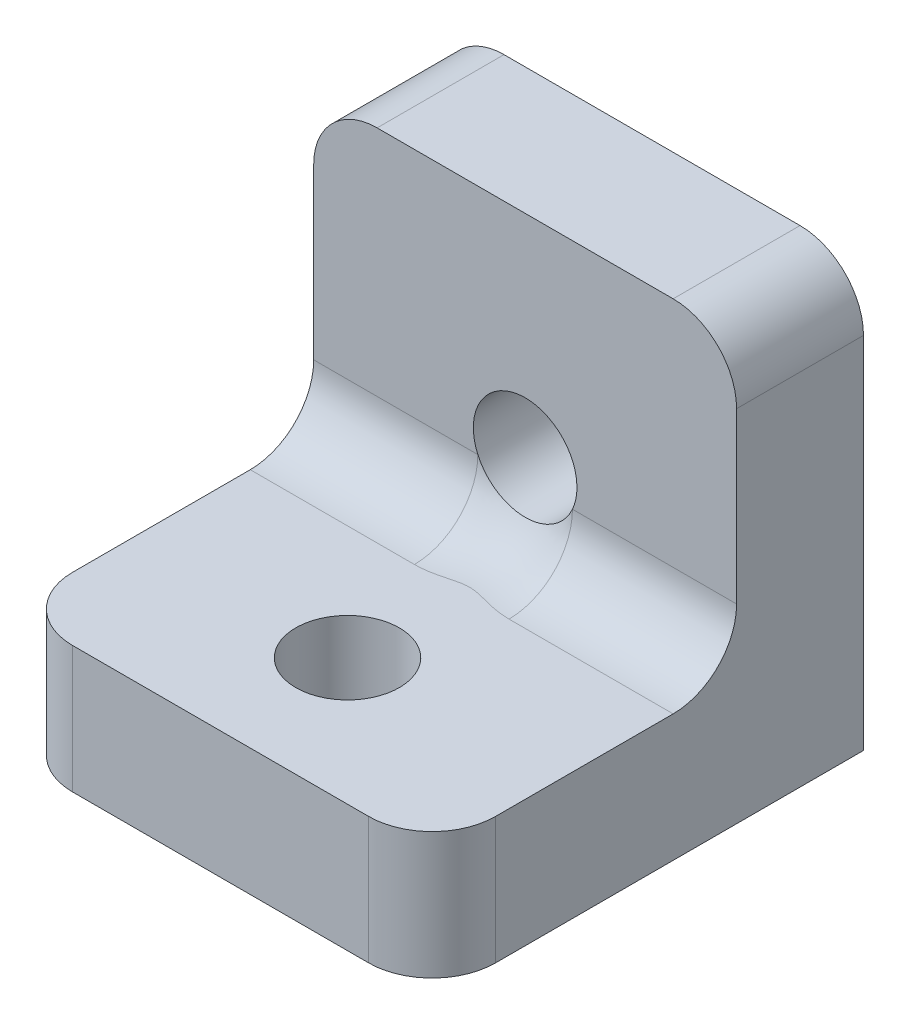
ISO-10303-21;
HEADER;
FILE_DESCRIPTION(('STEP AP214'),'2;1');
FILE_NAME('part.step','',(''),(''),'','','');
FILE_SCHEMA(('AUTOMOTIVE_DESIGN { 1 0 10303 214 1 1 1 1 }'));
ENDSEC;
DATA;
#1=APPLICATION_CONTEXT('core data for automotive mechanical design processes');
#2=APPLICATION_PROTOCOL_DEFINITION('international standard','automotive_design',2000,#1);
#3=PRODUCT_CONTEXT('',#1,'mechanical');
#4=PRODUCT('Part','Part','',(#3));
#5=PRODUCT_RELATED_PRODUCT_CATEGORY('part','',(#4));
#6=PRODUCT_DEFINITION_FORMATION('','',#4);
#7=PRODUCT_DEFINITION_CONTEXT('part definition',#1,'design');
#8=PRODUCT_DEFINITION('design','',#6,#7);
#9=PRODUCT_DEFINITION_SHAPE('','',#8);
#10=(LENGTH_UNIT() NAMED_UNIT(*) SI_UNIT(.MILLI.,.METRE.));
#11=(NAMED_UNIT(*) PLANE_ANGLE_UNIT() SI_UNIT($,.RADIAN.));
#12=(NAMED_UNIT(*) SI_UNIT($,.STERADIAN.) SOLID_ANGLE_UNIT());
#13=UNCERTAINTY_MEASURE_WITH_UNIT(LENGTH_MEASURE(1.E-05),#10,'distance_accuracy_value','');
#14=(GEOMETRIC_REPRESENTATION_CONTEXT(3) GLOBAL_UNCERTAINTY_ASSIGNED_CONTEXT((#13)) GLOBAL_UNIT_ASSIGNED_CONTEXT((#10,
#11,#12)) REPRESENTATION_CONTEXT('',''));
#15=CARTESIAN_POINT('',(0.,0.,0.));
#16=DIRECTION('',(0.,0.,1.));
#17=DIRECTION('',(1.,0.,0.));
#18=AXIS2_PLACEMENT_3D('',#15,#16,#17);
#19=CARTESIAN_POINT('',(0.,0.,6.));
#20=DIRECTION('',(1.,0.,0.));
#21=DIRECTION('',(0.,1.,0.));
#22=AXIS2_PLACEMENT_3D('',#19,#20,#21);
#23=PLANE('',#22);
#24=DIRECTION('',(0.,-1.,0.));
#25=VECTOR('',#24,1.);
#26=CARTESIAN_POINT('',(0.,0.,6.));
#27=LINE('',#26,#25);
#28=CARTESIAN_POINT('',(0.,-3.,6.));
#29=VERTEX_POINT('',#28);
#30=CARTESIAN_POINT('',(0.,-11.,6.));
#31=VERTEX_POINT('',#30);
#32=EDGE_CURVE('E167',#29,#31,#27,.T.);
#33=ORIENTED_EDGE('',*,*,#32,.F.);
#34=DIRECTION('',(0.,0.,-1.));
#35=VECTOR('',#34,1.);
#36=CARTESIAN_POINT('',(0.,-3.,6.));
#37=LINE('',#36,#35);
#38=CARTESIAN_POINT('',(0.,-3.,0.));
#39=VERTEX_POINT('',#38);
#40=EDGE_CURVE('E153',#29,#39,#37,.T.);
#41=ORIENTED_EDGE('',*,*,#40,.T.);
#42=DIRECTION('',(0.,-1.,0.));
#43=VECTOR('',#42,1.);
#44=CARTESIAN_POINT('',(0.,0.,0.));
#45=LINE('',#44,#43);
#46=CARTESIAN_POINT('',(0.,-20.,0.));
#47=VERTEX_POINT('',#46);
#48=EDGE_CURVE('E151',#39,#47,#45,.T.);
#49=ORIENTED_EDGE('',*,*,#48,.T.);
#50=DIRECTION('',(0.,0.,-1.));
#51=VECTOR('',#50,1.);
#52=CARTESIAN_POINT('',(0.,-20.,6.));
#53=LINE('',#52,#51);
#54=CARTESIAN_POINT('',(0.,-20.,17.4));
#55=VERTEX_POINT('',#54);
#56=EDGE_CURVE('E136',#55,#47,#53,.T.);
#57=ORIENTED_EDGE('',*,*,#56,.F.);
#58=DIRECTION('',(0.,-1.,0.));
#59=VECTOR('',#58,1.);
#60=CARTESIAN_POINT('',(0.,0.,17.4));
#61=LINE('',#60,#59);
#62=CARTESIAN_POINT('',(0.,-14.,17.4));
#63=VERTEX_POINT('',#62);
#64=EDGE_CURVE('E146',#55,#63,#61,.F.);
#65=ORIENTED_EDGE('',*,*,#64,.T.);
#66=DIRECTION('',(0.,0.,-1.));
#67=VECTOR('',#66,1.);
#68=CARTESIAN_POINT('',(0.,-14.,20.4));
#69=LINE('',#68,#67);
#70=CARTESIAN_POINT('',(0.,-14.,9.));
#71=VERTEX_POINT('',#70);
#72=EDGE_CURVE('E266',#63,#71,#69,.T.);
#73=ORIENTED_EDGE('',*,*,#72,.T.);
#74=CARTESIAN_POINT('',(0.,-11.,9.));
#75=DIRECTION('',(1.,0.,0.));
#76=DIRECTION('',(0.,1.,0.));
#77=AXIS2_PLACEMENT_3D('',#74,#75,#76);
#78=CIRCLE('',#77,3.);
#79=EDGE_CURVE('E48',#71,#31,#78,.T.);
#80=ORIENTED_EDGE('',*,*,#79,.T.);
#81=EDGE_LOOP('',(#33,#41,#49,#57,#65,#73,#80));
#82=FACE_BOUND('',#81,.T.);
#83=ADVANCED_FACE('F35',(#82),#23,.F.);
#84=CARTESIAN_POINT('',(0.,-20.,6.));
#85=DIRECTION('',(0.,1.,0.));
#86=DIRECTION('',(0.,0.,1.));
#87=AXIS2_PLACEMENT_3D('',#84,#85,#86);
#88=PLANE('',#87);
#89=CARTESIAN_POINT('',(10.,-20.,14.4));
#90=DIRECTION('',(0.,1.,0.));
#91=DIRECTION('',(0.,0.,1.));
#92=AXIS2_PLACEMENT_3D('',#89,#90,#91);
#93=CIRCLE('',#92,2.45);
#94=CARTESIAN_POINT('',(10.,-20.,16.85));
#95=VERTEX_POINT('',#94);
#96=EDGE_CURVE('E313',#95,#95,#93,.T.);
#97=ORIENTED_EDGE('',*,*,#96,.T.);
#98=EDGE_LOOP('',(#97));
#99=FACE_BOUND('',#98,.T.);
#100=DIRECTION('',(0.,0.,-1.));
#101=VECTOR('',#100,1.);
#102=CARTESIAN_POINT('',(20.,-20.,6.));
#103=LINE('',#102,#101);
#104=CARTESIAN_POINT('',(20.,-20.,17.4));
#105=VERTEX_POINT('',#104);
#106=CARTESIAN_POINT('',(20.,-20.,0.));
#107=VERTEX_POINT('',#106);
#108=EDGE_CURVE('E147',#105,#107,#103,.T.);
#109=ORIENTED_EDGE('',*,*,#108,.F.);
#110=CARTESIAN_POINT('',(17.,-20.,17.4));
#111=DIRECTION('',(0.,1.,0.));
#112=DIRECTION('',(0.,0.,1.));
#113=AXIS2_PLACEMENT_3D('',#110,#111,#112);
#114=CIRCLE('',#113,3.);
#115=CARTESIAN_POINT('',(17.,-20.,20.4));
#116=VERTEX_POINT('',#115);
#117=EDGE_CURVE('E201',#105,#116,#114,.F.);
#118=ORIENTED_EDGE('',*,*,#117,.T.);
#119=DIRECTION('',(1.,0.,0.));
#120=VECTOR('',#119,1.);
#121=CARTESIAN_POINT('',(0.,-20.,20.4));
#122=LINE('',#121,#120);
#123=CARTESIAN_POINT('',(3.,-20.,20.4));
#124=VERTEX_POINT('',#123);
#125=EDGE_CURVE('E272',#124,#116,#122,.T.);
#126=ORIENTED_EDGE('',*,*,#125,.F.);
#127=CARTESIAN_POINT('',(3.,-20.,17.4));
#128=DIRECTION('',(0.,1.,0.));
#129=DIRECTION('',(0.,0.,1.));
#130=AXIS2_PLACEMENT_3D('',#127,#128,#129);
#131=CIRCLE('',#130,3.);
#132=EDGE_CURVE('E144',#124,#55,#131,.F.);
#133=ORIENTED_EDGE('',*,*,#132,.T.);
#134=ORIENTED_EDGE('',*,*,#56,.T.);
#135=DIRECTION('',(1.,0.,0.));
#136=VECTOR('',#135,1.);
#137=CARTESIAN_POINT('',(0.,-20.,0.));
#138=LINE('',#137,#136);
#139=EDGE_CURVE('E141',#47,#107,#138,.T.);
#140=ORIENTED_EDGE('',*,*,#139,.T.);
#141=EDGE_LOOP('',(#109,#118,#126,#133,#134,#140));
#142=FACE_BOUND('',#141,.T.);
#143=ADVANCED_FACE('F139',(#99,#142),#88,.F.);
#144=CARTESIAN_POINT('',(20.,0.,6.));
#145=DIRECTION('',(-1.,0.,0.));
#146=DIRECTION('',(0.,-1.,0.));
#147=AXIS2_PLACEMENT_3D('',#144,#145,#146);
#148=PLANE('',#147);
#149=DIRECTION('',(0.,1.,0.));
#150=VECTOR('',#149,1.);
#151=CARTESIAN_POINT('',(20.,0.,0.));
#152=LINE('',#151,#150);
#153=CARTESIAN_POINT('',(20.,-3.,0.));
#154=VERTEX_POINT('',#153);
#155=EDGE_CURVE('E159',#107,#154,#152,.T.);
#156=ORIENTED_EDGE('',*,*,#155,.T.);
#157=DIRECTION('',(0.,0.,-1.));
#158=VECTOR('',#157,1.);
#159=CARTESIAN_POINT('',(20.,-3.,6.));
#160=LINE('',#159,#158);
#161=CARTESIAN_POINT('',(20.,-3.,6.));
#162=VERTEX_POINT('',#161);
#163=EDGE_CURVE('E187',#154,#162,#160,.F.);
#164=ORIENTED_EDGE('',*,*,#163,.T.);
#165=DIRECTION('',(0.,1.,0.));
#166=VECTOR('',#165,1.);
#167=CARTESIAN_POINT('',(20.,0.,6.));
#168=LINE('',#167,#166);
#169=CARTESIAN_POINT('',(20.,-11.,6.));
#170=VERTEX_POINT('',#169);
#171=EDGE_CURVE('E277',#170,#162,#168,.T.);
#172=ORIENTED_EDGE('',*,*,#171,.F.);
#173=CARTESIAN_POINT('',(20.,-11.,9.));
#174=DIRECTION('',(-1.,0.,0.));
#175=DIRECTION('',(0.,-1.,0.));
#176=AXIS2_PLACEMENT_3D('',#173,#174,#175);
#177=CIRCLE('',#176,3.);
#178=CARTESIAN_POINT('',(20.,-14.,9.));
#179=VERTEX_POINT('',#178);
#180=EDGE_CURVE('E11',#170,#179,#177,.T.);
#181=ORIENTED_EDGE('',*,*,#180,.T.);
#182=DIRECTION('',(0.,0.,-1.));
#183=VECTOR('',#182,1.);
#184=CARTESIAN_POINT('',(20.,-14.,20.4));
#185=LINE('',#184,#183);
#186=CARTESIAN_POINT('',(20.,-14.,17.4));
#187=VERTEX_POINT('',#186);
#188=EDGE_CURVE('E155',#187,#179,#185,.T.);
#189=ORIENTED_EDGE('',*,*,#188,.F.);
#190=DIRECTION('',(0.,1.,0.));
#191=VECTOR('',#190,1.);
#192=CARTESIAN_POINT('',(20.,0.,17.4));
#193=LINE('',#192,#191);
#194=EDGE_CURVE('E185',#187,#105,#193,.F.);
#195=ORIENTED_EDGE('',*,*,#194,.T.);
#196=ORIENTED_EDGE('',*,*,#108,.T.);
#197=EDGE_LOOP('',(#156,#164,#172,#181,#189,#195,#196));
#198=FACE_BOUND('',#197,.T.);
#199=ADVANCED_FACE('F293',(#198),#148,.F.);
#200=CARTESIAN_POINT('',(0.,0.,6.));
#201=DIRECTION('',(0.,-1.,0.));
#202=DIRECTION('',(0.,0.,-1.));
#203=AXIS2_PLACEMENT_3D('',#200,#201,#202);
#204=PLANE('',#203);
#205=DIRECTION('',(-1.,0.,0.));
#206=VECTOR('',#205,1.);
#207=CARTESIAN_POINT('',(0.,0.,0.));
#208=LINE('',#207,#206);
#209=CARTESIAN_POINT('',(17.,0.,0.));
#210=VERTEX_POINT('',#209);
#211=CARTESIAN_POINT('',(3.,0.,0.));
#212=VERTEX_POINT('',#211);
#213=EDGE_CURVE('E161',#210,#212,#208,.T.);
#214=ORIENTED_EDGE('',*,*,#213,.T.);
#215=DIRECTION('',(0.,0.,-1.));
#216=VECTOR('',#215,1.);
#217=CARTESIAN_POINT('',(3.,0.,6.));
#218=LINE('',#217,#216);
#219=CARTESIAN_POINT('',(3.,0.,6.));
#220=VERTEX_POINT('',#219);
#221=EDGE_CURVE('E179',#212,#220,#218,.F.);
#222=ORIENTED_EDGE('',*,*,#221,.T.);
#223=DIRECTION('',(-1.,0.,0.));
#224=VECTOR('',#223,1.);
#225=CARTESIAN_POINT('',(0.,0.,6.));
#226=LINE('',#225,#224);
#227=CARTESIAN_POINT('',(17.,0.,6.));
#228=VERTEX_POINT('',#227);
#229=EDGE_CURVE('E168',#228,#220,#226,.T.);
#230=ORIENTED_EDGE('',*,*,#229,.F.);
#231=DIRECTION('',(0.,0.,-1.));
#232=VECTOR('',#231,1.);
#233=CARTESIAN_POINT('',(17.,0.,6.));
#234=LINE('',#233,#232);
#235=EDGE_CURVE('E176',#228,#210,#234,.T.);
#236=ORIENTED_EDGE('',*,*,#235,.T.);
#237=EDGE_LOOP('',(#214,#222,#230,#236));
#238=FACE_BOUND('',#237,.T.);
#239=ADVANCED_FACE('F288',(#238),#204,.F.);
#240=CARTESIAN_POINT('',(0.,0.,6.));
#241=DIRECTION('',(0.,0.,1.));
#242=DIRECTION('',(1.,0.,0.));
#243=AXIS2_PLACEMENT_3D('',#240,#241,#242);
#244=PLANE('',#243);
#245=ORIENTED_EDGE('',*,*,#32,.T.);
#246=DIRECTION('',(-1.,0.,0.));
#247=VECTOR('',#246,1.);
#248=CARTESIAN_POINT('',(0.,-11.,6.));
#249=LINE('',#248,#247);
#250=CARTESIAN_POINT('',(7.76337307536549,-11.,6.));
#251=VERTEX_POINT('',#250);
#252=EDGE_CURVE('E248',#31,#251,#249,.F.);
#253=ORIENTED_EDGE('',*,*,#252,.T.);
#254=CARTESIAN_POINT('',(10.,-10.,6.));
#255=DIRECTION('',(0.,0.,1.));
#256=DIRECTION('',(1.,0.,0.));
#257=AXIS2_PLACEMENT_3D('',#254,#255,#256);
#258=CIRCLE('',#257,2.45);
#259=CARTESIAN_POINT('',(12.2366269246345,-11.,6.));
#260=VERTEX_POINT('',#259);
#261=EDGE_CURVE('E309',#260,#251,#258,.T.);
#262=ORIENTED_EDGE('',*,*,#261,.F.);
#263=DIRECTION('',(-1.,0.,0.));
#264=VECTOR('',#263,1.);
#265=CARTESIAN_POINT('',(0.,-11.,6.));
#266=LINE('',#265,#264);
#267=EDGE_CURVE('E56',#260,#170,#266,.F.);
#268=ORIENTED_EDGE('',*,*,#267,.T.);
#269=ORIENTED_EDGE('',*,*,#171,.T.);
#270=CARTESIAN_POINT('',(17.,-3.,6.));
#271=DIRECTION('',(0.,0.,1.));
#272=DIRECTION('',(1.,0.,0.));
#273=AXIS2_PLACEMENT_3D('',#270,#271,#272);
#274=CIRCLE('',#273,3.);
#275=EDGE_CURVE('E181',#162,#228,#274,.T.);
#276=ORIENTED_EDGE('',*,*,#275,.T.);
#277=ORIENTED_EDGE('',*,*,#229,.T.);
#278=CARTESIAN_POINT('',(3.,-3.,6.));
#279=DIRECTION('',(0.,0.,1.));
#280=DIRECTION('',(1.,0.,0.));
#281=AXIS2_PLACEMENT_3D('',#278,#279,#280);
#282=CIRCLE('',#281,3.);
#283=EDGE_CURVE('E183',#220,#29,#282,.T.);
#284=ORIENTED_EDGE('',*,*,#283,.T.);
#285=EDGE_LOOP('',(#245,#253,#262,#268,#269,#276,#277,#284));
#286=FACE_BOUND('',#285,.T.);
#287=ADVANCED_FACE('F233',(#286),#244,.T.);
#288=CARTESIAN_POINT('',(0.,0.,0.));
#289=DIRECTION('',(0.,0.,1.));
#290=DIRECTION('',(1.,0.,0.));
#291=AXIS2_PLACEMENT_3D('',#288,#289,#290);
#292=PLANE('',#291);
#293=CARTESIAN_POINT('',(10.,-10.,0.));
#294=DIRECTION('',(0.,0.,1.));
#295=DIRECTION('',(1.,0.,0.));
#296=AXIS2_PLACEMENT_3D('',#293,#294,#295);
#297=CIRCLE('',#296,2.45);
#298=CARTESIAN_POINT('',(12.45,-10.,0.));
#299=VERTEX_POINT('',#298);
#300=EDGE_CURVE('E305',#299,#299,#297,.T.);
#301=ORIENTED_EDGE('',*,*,#300,.T.);
#302=EDGE_LOOP('',(#301));
#303=FACE_BOUND('',#302,.T.);
#304=ORIENTED_EDGE('',*,*,#48,.F.);
#305=CARTESIAN_POINT('',(3.,-3.,0.));
#306=DIRECTION('',(0.,0.,1.));
#307=DIRECTION('',(1.,0.,0.));
#308=AXIS2_PLACEMENT_3D('',#305,#306,#307);
#309=CIRCLE('',#308,3.);
#310=EDGE_CURVE('E174',#39,#212,#309,.F.);
#311=ORIENTED_EDGE('',*,*,#310,.T.);
#312=ORIENTED_EDGE('',*,*,#213,.F.);
#313=CARTESIAN_POINT('',(17.,-3.,0.));
#314=DIRECTION('',(0.,0.,1.));
#315=DIRECTION('',(1.,0.,0.));
#316=AXIS2_PLACEMENT_3D('',#313,#314,#315);
#317=CIRCLE('',#316,3.);
#318=EDGE_CURVE('E172',#210,#154,#317,.F.);
#319=ORIENTED_EDGE('',*,*,#318,.T.);
#320=ORIENTED_EDGE('',*,*,#155,.F.);
#321=ORIENTED_EDGE('',*,*,#139,.F.);
#322=EDGE_LOOP('',(#304,#311,#312,#319,#320,#321));
#323=FACE_BOUND('',#322,.T.);
#324=ADVANCED_FACE('F157',(#303,#323),#292,.F.);
#325=CARTESIAN_POINT('',(0.,-14.,20.4));
#326=DIRECTION('',(0.,-1.,0.));
#327=DIRECTION('',(0.,0.,-1.));
#328=AXIS2_PLACEMENT_3D('',#325,#326,#327);
#329=PLANE('',#328);
#330=CARTESIAN_POINT('',(10.,-14.,14.4));
#331=DIRECTION('',(0.,1.,0.));
#332=DIRECTION('',(0.,0.,1.));
#333=AXIS2_PLACEMENT_3D('',#330,#331,#332);
#334=CIRCLE('',#333,2.45);
#335=CARTESIAN_POINT('',(10.,-14.,16.85));
#336=VERTEX_POINT('',#335);
#337=EDGE_CURVE('E244',#336,#336,#334,.T.);
#338=ORIENTED_EDGE('',*,*,#337,.F.);
#339=EDGE_LOOP('',(#338));
#340=FACE_BOUND('',#339,.T.);
#341=ORIENTED_EDGE('',*,*,#188,.T.);
#342=DIRECTION('',(-1.,0.,0.));
#343=VECTOR('',#342,1.);
#344=CARTESIAN_POINT('',(0.,-14.,9.));
#345=LINE('',#344,#343);
#346=CARTESIAN_POINT('',(12.2366269246345,-14.,9.));
#347=VERTEX_POINT('',#346);
#348=EDGE_CURVE('E212',#179,#347,#345,.T.);
#349=ORIENTED_EDGE('',*,*,#348,.T.);
#350=CARTESIAN_POINT('',(13.0365617826891,-14.,8.90551453709537));
#351=CARTESIAN_POINT('',(12.2671345212374,-14.,5.75459278773427));
#352=CARTESIAN_POINT('',(12.3270607949738,-10.7663472166687,6.));
#353=CARTESIAN_POINT('',(12.9505445251188,-14.,8.92653785787727));
#354=CARTESIAN_POINT('',(12.2727685534342,-14.,5.77504625213228));
#355=CARTESIAN_POINT('',(12.3205645694159,-10.7859610833736,6.));
#356=CARTESIAN_POINT('',(12.8636715647164,-14.,8.94397317100065));
#357=CARTESIAN_POINT('',(12.2762584293017,-14.,5.79770823449024));
#358=CARTESIAN_POINT('',(12.313351115938,-10.8071329346608,6.));
#359=CARTESIAN_POINT('',(12.6888656537812,-14.,8.97181030916078));
#360=CARTESIAN_POINT('',(12.2772754310847,-14.,5.84730456025411));
#361=CARTESIAN_POINT('',(12.2967096069904,-10.8533910982525,6.));
#362=CARTESIAN_POINT('',(12.6009334954104,-14.,8.98221709416189));
#363=CARTESIAN_POINT('',(12.2748543671277,-14.,5.87416941481242));
#364=CARTESIAN_POINT('',(12.2872831195812,-10.8784746346996,6.));
#365=CARTESIAN_POINT('',(12.4266088739021,-14.,8.99600513189034));
#366=CARTESIAN_POINT('',(12.262752984109,-14.,5.9313479147723));
#367=CARTESIAN_POINT('',(12.2656850824955,-10.9327353036768,6.));
#368=CARTESIAN_POINT('',(12.3402287535476,-14.,8.9995456494312));
#369=CARTESIAN_POINT('',(12.2533195839202,-14.,5.96148274365176));
#370=CARTESIAN_POINT('',(12.2535832046177,-10.9618024553327,6.));
#371=CARTESIAN_POINT('',(12.1674402637079,-14.,9.00037198805776));
#372=CARTESIAN_POINT('',(12.2256986531116,-14.,6.02540054808856));
#373=CARTESIAN_POINT('',(12.2253494188804,-11.0254475428967,6.));
#374=CARTESIAN_POINT('',(12.0810318928265,-14.,8.99765742957968));
#375=CARTESIAN_POINT('',(12.207625482932,-14.,6.05909253198798));
#376=CARTESIAN_POINT('',(12.2092172665131,-11.060025813106,6.));
#377=CARTESIAN_POINT('',(11.9135121384518,-14.,8.98671822224664));
#378=CARTESIAN_POINT('',(12.1620406009522,-14.,6.12768938442363));
#379=CARTESIAN_POINT('',(12.1722799751501,-11.1337123926691,6.));
#380=CARTESIAN_POINT('',(11.8323789624775,-14.,8.97881569303439));
#381=CARTESIAN_POINT('',(12.1352900201208,-14.,6.16230209726931));
#382=CARTESIAN_POINT('',(12.1517927426436,-11.172451272834,6.));
#383=CARTESIAN_POINT('',(11.6707128684689,-14.,8.95833186844074));
#384=CARTESIAN_POINT('',(12.0702079585473,-14.,6.23380574356741));
#385=CARTESIAN_POINT('',(12.1035228370886,-11.2570114904029,6.));
#386=CARTESIAN_POINT('',(11.5901799704451,-14.,8.94575041779077));
#387=CARTESIAN_POINT('',(12.0320888194827,-14.,6.27059857516801));
#388=CARTESIAN_POINT('',(12.0757399219442,-11.3028330628143,6.));
#389=CARTESIAN_POINT('',(11.428780591885,-14.,8.91641950068636));
#390=CARTESIAN_POINT('',(11.9412665720106,-14.,6.34613746234917));
#391=CARTESIAN_POINT('',(12.0091834760717,-11.4033453992328,6.));
#392=CARTESIAN_POINT('',(11.3479239885203,-14.,8.89961668053618));
#393=CARTESIAN_POINT('',(11.8886759521421,-14.,6.38480762201969));
#394=CARTESIAN_POINT('',(11.9702682979127,-11.4581463067001,6.));
#395=CARTESIAN_POINT('',(11.1869406384162,-14.,8.8629601759956));
#396=CARTESIAN_POINT('',(11.7661398757062,-14.,6.46242452436919));
#397=CARTESIAN_POINT('',(11.8765493430921,-11.576980379682,6.));
#398=CARTESIAN_POINT('',(11.1068137363196,-14.,8.84310715789248));
#399=CARTESIAN_POINT('',(11.6966190937936,-14.,6.50128243428418));
#400=CARTESIAN_POINT('',(11.8217490340766,-11.6410115287484,6.));
#401=CARTESIAN_POINT('',(10.981548909411,-14.,8.81078842870554));
#402=CARTESIAN_POINT('',(11.5708695716701,-14.,6.561194431036));
#403=CARTESIAN_POINT('',(11.7175097886423,-11.7480057732463,6.));
#404=CARTESIAN_POINT('',(10.9362726581216,-14.,8.79884309708352));
#405=CARTESIAN_POINT('',(11.5223186752144,-14.,6.58253214021918));
#406=CARTESIAN_POINT('',(11.676010353357,-11.7880972077409,6.));
#407=CARTESIAN_POINT('',(10.8457482702793,-14.,8.77484177471219));
#408=CARTESIAN_POINT('',(11.4179608633237,-14.,6.62423402405077));
#409=CARTESIAN_POINT('',(11.5837060078208,-11.870351814101,6.));
#410=CARTESIAN_POINT('',(10.8005001342925,-14.,8.76278578180708));
#411=CARTESIAN_POINT('',(11.3622498068235,-14.,6.64460097120757));
#412=CARTESIAN_POINT('',(11.5329009159198,-11.9125150263969,6.));
#413=CARTESIAN_POINT('',(10.7098522472347,-14.,8.73901772686772));
#414=CARTESIAN_POINT('',(11.2429581441558,-14.,6.68382781909703));
#415=CARTESIAN_POINT('',(11.4200368018303,-11.9977482424711,6.));
#416=CARTESIAN_POINT('',(10.6644523775998,-14.,8.72730611112791));
#417=CARTESIAN_POINT('',(11.1794527029522,-14.,6.70270166754073));
#418=CARTESIAN_POINT('',(11.3579638647033,-12.0408193085931,6.));
#419=CARTESIAN_POINT('',(10.5734110124547,-14.,8.70483262406373));
#420=CARTESIAN_POINT('',(11.044300676635,-14.,6.73821948518297));
#421=CARTESIAN_POINT('',(11.2208245530034,-12.1256960575228,6.));
#422=CARTESIAN_POINT('',(10.5277695057458,-14.,8.69407079717234));
#423=CARTESIAN_POINT('',(10.9727055887337,-14.,6.75489467056843));
#424=CARTESIAN_POINT('',(11.1457575710296,-12.1675016810707,6.));
#425=CARTESIAN_POINT('',(10.4371091224209,-14.,8.67442303162705));
#426=CARTESIAN_POINT('',(10.823165064163,-14.,6.78486274097357));
#427=CARTESIAN_POINT('',(10.9833705672948,-12.2457531510202,6.));
#428=CARTESIAN_POINT('',(10.3920981432691,-14.,8.66550154076282));
#429=CARTESIAN_POINT('',(10.7453902313268,-14.,6.79826217194879));
#430=CARTESIAN_POINT('',(10.8963508284634,-12.2822953999197,6.));
#431=CARTESIAN_POINT('',(10.3016702660974,-14.,8.6499870353966));
#432=CARTESIAN_POINT('',(10.5831637933032,-14.,6.82128803287864));
#433=CARTESIAN_POINT('',(10.7095099223666,-12.3470902245329,6.));
#434=CARTESIAN_POINT('',(10.2562534252491,-14.,8.64339369807963));
#435=CARTESIAN_POINT('',(10.4986014606636,-14.,6.83096602426422));
#436=CARTESIAN_POINT('',(10.609690532482,-12.3753439494172,6.));
#437=CARTESIAN_POINT('',(10.1652227374156,-14.,8.63323906723836));
#438=CARTESIAN_POINT('',(10.3251062874244,-14.,6.84575306144658));
#439=CARTESIAN_POINT('',(10.400733062797,-12.4193452558319,6.));
#440=CARTESIAN_POINT('',(10.119610050489,-14.,8.62966774769632));
#441=CARTESIAN_POINT('',(10.2359677160752,-14.,6.85092053973343));
#442=CARTESIAN_POINT('',(10.2916271292225,-12.4351341795125,6.));
#443=CARTESIAN_POINT('',(10.0282450133263,-14.,8.62596024988172));
#444=CARTESIAN_POINT('',(10.0561370128822,-14.,6.85626573420064));
#445=CARTESIAN_POINT('',(10.0696319293331,-12.4515305218547,6.));
#446=CARTESIAN_POINT('',(9.98249268528619,-14.,8.62582355148762));
#447=CARTESIAN_POINT('',(9.96514115573016,-14.,6.85646252189228));
#448=CARTESIAN_POINT('',(9.9567432384524,-12.4521402391778,6.));
#449=CARTESIAN_POINT('',(9.89917184908834,-14.,8.62871595757469));
#450=CARTESIAN_POINT('',(9.80095418744291,-14.,6.85229462695611));
#451=CARTESIAN_POINT('',(9.75383279811042,-12.4393418337166,6.));
#452=CARTESIAN_POINT('',(9.86158247490364,-14.,8.63119122621437));
#453=CARTESIAN_POINT('',(9.72724352537849,-14.,6.84871821411537));
#454=CARTESIAN_POINT('',(9.66328812617368,-12.4283858997192,6.));
#455=CARTESIAN_POINT('',(9.78660589040352,-14.,8.63826400139416));
#456=CARTESIAN_POINT('',(9.58275982858414,-14.,6.83845404196469));
#457=CARTESIAN_POINT('',(9.48780708159499,-12.397519264509,6.));
#458=CARTESIAN_POINT('',(9.74921869207466,-14.,8.64286163239865));
#459=CARTESIAN_POINT('',(9.51184884907391,-14.,6.83174462882862));
#460=CARTESIAN_POINT('',(9.40287103820093,-12.3776080381216,6.));
#461=CARTESIAN_POINT('',(9.67461280939762,-14.,8.6538493824757));
#462=CARTESIAN_POINT('',(9.37401559403259,-14.,6.81558787544697));
#463=CARTESIAN_POINT('',(9.24068185116537,-12.3309003660914,6.));
#464=CARTESIAN_POINT('',(9.63739484377068,-14.,8.66024426555782));
#465=CARTESIAN_POINT('',(9.30701591632507,-14.,6.80610548371108));
#466=CARTESIAN_POINT('',(9.16344987627043,-12.3040856372845,6.));
#467=CARTESIAN_POINT('',(9.56322669984345,-14.,8.67441398938985));
#468=CARTESIAN_POINT('',(9.17792874459642,-14.,6.78487090012805));
#469=CARTESIAN_POINT('',(9.01795485668823,-12.2459375775184,6.));
#470=CARTESIAN_POINT('',(9.5262765284587,-14.,8.68218886564554));
#471=CARTESIAN_POINT('',(9.1158017582055,-14.,6.7730910499759));
#472=CARTESIAN_POINT('',(8.94969204284676,-12.2146041303011,6.));
#473=CARTESIAN_POINT('',(9.45178879431601,-14.,8.69889726358655));
#474=CARTESIAN_POINT('',(8.99543308609046,-14.,6.74743338063047));
#475=CARTESIAN_POINT('',(8.82076079393902,-12.148780135619,6.));
#476=CARTESIAN_POINT('',(9.41425618166813,-14.,8.70785250364928));
#477=CARTESIAN_POINT('',(8.93731770522876,-14.,6.73349317205971));
#478=CARTESIAN_POINT('',(8.76029236044711,-12.1142353164657,6.));
#479=CARTESIAN_POINT('',(9.33935023817943,-14.,8.7263948735707));
#480=CARTESIAN_POINT('',(8.82651664887722,-14.,6.70415232602505));
#481=CARTESIAN_POINT('',(8.64810738271031,-12.044323100661,6.));
#482=CARTESIAN_POINT('',(9.30197690465451,-14.,8.73598199273608));
#483=CARTESIAN_POINT('',(8.77386028400453,-14.,6.68873444790289));
#484=CARTESIAN_POINT('',(8.59639069041216,-12.0089557179364,6.));
#485=CARTESIAN_POINT('',(9.22734265156552,-14.,8.75544641793847));
#486=CARTESIAN_POINT('',(8.67382220394291,-14.,6.65682864010955));
#487=CARTESIAN_POINT('',(8.50077797178721,-11.9386473805343,6.));
#488=CARTESIAN_POINT('',(9.19008166104301,-14.,8.76532345464444));
#489=CARTESIAN_POINT('',(8.62648099661867,-14.,6.64033158789346));
#490=CARTESIAN_POINT('',(8.45687493876615,-11.9037060702504,6.));
#491=CARTESIAN_POINT('',(9.11556547013054,-14.,8.78509942897688));
#492=CARTESIAN_POINT('',(8.53672300019131,-14.,6.60656908464589));
#493=CARTESIAN_POINT('',(8.37578066131677,-11.8350008522326,6.));
#494=CARTESIAN_POINT('',(9.07831026977684,-14.,8.79499836673502));
#495=CARTESIAN_POINT('',(8.49435875195799,-14.,6.58929990650915));
#496=CARTESIAN_POINT('',(8.33858945735541,-11.8012369515986,6.));
#497=CARTESIAN_POINT('',(8.98041138492563,-14.,8.82071281513757));
#498=CARTESIAN_POINT('',(8.38884951296159,-14.,6.54317443575208));
#499=CARTESIAN_POINT('',(8.24840038081699,-11.714766347933,6.));
#500=CARTESIAN_POINT('',(8.91972109428259,-14.,8.8363542906332));
#501=CARTESIAN_POINT('',(8.32994597223983,-14.,6.51403989163476));
#502=CARTESIAN_POINT('',(8.20007548008405,-11.6634278633025,6.));
#503=CARTESIAN_POINT('',(8.79800815706333,-14.,8.86629946491833));
#504=CARTESIAN_POINT('',(8.22270041922969,-14.,6.45535072184678));
#505=CARTESIAN_POINT('',(8.11471086024678,-11.5659993744823,6.));
#506=CARTESIAN_POINT('',(8.73698552065579,-14.,8.8806032043975));
#507=CARTESIAN_POINT('',(8.17456628783284,-14.,6.42582538391519));
#508=CARTESIAN_POINT('',(8.07767079781623,-11.5199092106461,6.));
#509=CARTESIAN_POINT('',(8.61451604345803,-14.,8.90730308531059));
#510=CARTESIAN_POINT('',(8.08749459466958,-14.,6.36701467471888));
#511=CARTESIAN_POINT('',(8.01200703036392,-11.4329505069996,6.));
#512=CARTESIAN_POINT('',(8.55306918344637,-14.,8.91969913970724));
#513=CARTESIAN_POINT('',(8.0487298719815,-14.,6.33777015626145));
#514=CARTESIAN_POINT('',(7.98338370929792,-11.3920822054488,6.));
#515=CARTESIAN_POINT('',(8.42974466439726,-14.,8.94214790065473));
#516=CARTESIAN_POINT('',(7.97919699709555,-14.,6.28003177387733));
#517=CARTESIAN_POINT('',(7.93242586383022,-11.3152021455295,6.));
#518=CARTESIAN_POINT('',(8.36786700546712,-14.,8.95220060778922));
#519=CARTESIAN_POINT('',(7.9485655531782,-14.,6.25158316314451));
#520=CARTESIAN_POINT('',(7.91009133786217,-11.2791903859514,6.));
#521=CARTESIAN_POINT('',(8.24469665891493,-14.,8.96949207210968));
#522=CARTESIAN_POINT('',(7.89467030567412,-14.,6.19626417159659));
#523=CARTESIAN_POINT('',(7.87045945321194,-11.2120440118943,6.));
#524=CARTESIAN_POINT('',(8.18340987687704,-14.,8.97677222950408));
#525=CARTESIAN_POINT('',(7.87139623762373,-14.,6.16941513569076));
#526=CARTESIAN_POINT('',(7.85308903855644,-11.1808421543218,6.));
#527=CARTESIAN_POINT('',(8.0605651631736,-14.,8.98849255430606));
#528=CARTESIAN_POINT('',(7.83070467356646,-14.,6.11710663766714));
#529=CARTESIAN_POINT('',(7.82184612320521,-11.1221589623274,6.));
#530=CARTESIAN_POINT('',(7.99900720820149,-14.,8.992932472611));
#531=CARTESIAN_POINT('',(7.81336436086499,-14.,6.09168816680086));
#532=CARTESIAN_POINT('',(7.80797392938489,-11.0946779544086,6.));
#533=CARTESIAN_POINT('',(7.81412276975832,-14.,9.0016837434753));
#534=CARTESIAN_POINT('',(7.76873748647636,-14.,6.01754789291375));
#535=CARTESIAN_POINT('',(7.77034465343523,-11.0171021350246,6.));
#536=CARTESIAN_POINT('',(7.6905283738649,-14.,9.00143503579597));
#537=CARTESIAN_POINT('',(7.74953485095491,-14.,5.97176183744936));
#538=CARTESIAN_POINT('',(7.75055818072807,-10.9718442890202,6.));
#539=CARTESIAN_POINT('',(7.47855005606276,-14.,8.9896467745954));
#540=CARTESIAN_POINT('',(7.729381687652,-14.,5.89957892550959));
#541=CARTESIAN_POINT('',(7.72204298744407,-10.9024144268838,6.));
#542=CARTESIAN_POINT('',(7.38997610390309,-14.,8.9812811158658));
#543=CARTESIAN_POINT('',(7.72491317175291,-14.,5.87134437343824));
#544=CARTESIAN_POINT('',(7.71176934927274,-10.8758839874617,6.));
#545=CARTESIAN_POINT('',(7.21379493814847,-14.,8.95749692741196));
#546=CARTESIAN_POINT('',(7.72225888985955,-14.,5.81902775132145));
#547=CARTESIAN_POINT('',(7.69364915599578,-10.8270020578868,6.));
#548=CARTESIAN_POINT('',(7.12618741405254,-14.,8.94208073477391));
#549=CARTESIAN_POINT('',(7.72412710916452,-14.,5.79501569920189));
#550=CARTESIAN_POINT('',(7.68580179807883,-10.8046491864242,6.));
#551=CARTESIAN_POINT('',(6.95029998400188,-14.,8.90360083029957));
#552=CARTESIAN_POINT('',(7.73290108517243,-14.,5.7506946047239));
#553=CARTESIAN_POINT('',(7.67167937614358,-10.762839032342,6.));
#554=CARTESIAN_POINT('',(6.86206070293708,-14.,8.88035068573338));
#555=CARTESIAN_POINT('',(7.73996807829356,-14.,5.73056193089466));
#556=CARTESIAN_POINT('',(7.66544992442963,-10.7434709737067,6.));
#557=CARTESIAN_POINT('',(6.68783777399497,-14.,8.82632709998437));
#558=CARTESIAN_POINT('',(7.75810628933251,-14.,5.69479376985184));
#559=CARTESIAN_POINT('',(7.65437534182369,-10.707723163166,6.));
#560=CARTESIAN_POINT('',(6.60185607323966,-14.,8.79554738637676));
#561=CARTESIAN_POINT('',(7.76919774574726,-14.,5.67921066661759));
#562=CARTESIAN_POINT('',(7.64953137242825,-10.6913459226977,6.));
#563=CARTESIAN_POINT('',(6.51738496606901,-14.,8.76102670721977));
#564=CARTESIAN_POINT('',(7.78162083412134,-14.,5.66590345071924));
#565=CARTESIAN_POINT('',(7.64515556085438,-10.6761713299342,6.));
#566=(BOUNDED_SURFACE() B_SPLINE_SURFACE(3,2,((#350,#351,#352),(#353,#354,#355),(#356,#357,
#358),(#359,#360,#361),(#362,#363,#364),(#365,#366,#367),(#368,#369,#370),(#371,#372,#373),
(#374,#375,#376),(#377,#378,#379),(#380,#381,#382),(#383,#384,#385),(#386,#387,#388),(#389,#390,
#391),(#392,#393,#394),(#395,#396,#397),(#398,#399,#400),(#401,#402,#403),(#404,#405,#406),
(#407,#408,#409),(#410,#411,#412),(#413,#414,#415),(#416,#417,#418),(#419,#420,#421),(#422,#423,
#424),(#425,#426,#427),(#428,#429,#430),(#431,#432,#433),(#434,#435,#436),(#437,#438,#439),
(#440,#441,#442),(#443,#444,#445),(#446,#447,#448),(#449,#450,#451),(#452,#453,#454),(#455,#456,
#457),(#458,#459,#460),(#461,#462,#463),(#464,#465,#466),(#467,#468,#469),(#470,#471,#472),
(#473,#474,#475),(#476,#477,#478),(#479,#480,#481),(#482,#483,#484),(#485,#486,#487),(#488,#489,
#490),(#491,#492,#493),(#494,#495,#496),(#497,#498,#499),(#500,#501,#502),(#503,#504,#505),
(#506,#507,#508),(#509,#510,#511),(#512,#513,#514),(#515,#516,#517),(#518,#519,#520),(#521,#522,
#523),(#524,#525,#526),(#527,#528,#529),(#530,#531,#532),(#533,#534,#535),(#536,#537,#538),
(#539,#540,#541),(#542,#543,#544),(#545,#546,#547),(#548,#549,#550),(#551,#552,#553),(#554,#555,
#556),(#557,#558,#559),(#560,#561,#562),(#563,#564,#565)),.UNSPECIFIED.,.F.,.F.,
.F.) B_SPLINE_SURFACE_WITH_KNOTS((4,2,2,2,2,2,2,2,2,2,2,2,2,2,2,2,2,2,2,2,2,2,2,2,2,2,2,2,2,2,2,
2,2,2,2,4),(3,3),(0.,0.265541900504876,0.530896214307726,0.790018276080024,1.04915606203181,
1.29355751104222,1.53796707116404,1.78563650026358,2.03325190500652,2.17372916272002,
2.31420916289732,2.45486384030522,2.59552509433138,2.7331426741822,2.87074116488009,
3.00788134094736,3.14500074907971,3.25794804582234,3.37090196711828,3.48415816812429,
3.59741728351629,3.71316688147756,3.82891452110648,3.94455783829174,4.06020185269059,
4.24821497345533,4.43622237359896,4.62423834895293,4.81225427747768,4.99734099105334,
5.18244393539928,5.55247665335419,5.81912814607526,6.08569131408863,6.35910802250327,
6.63275327799742),(0.,1.),
.UNSPECIFIED.) GEOMETRIC_REPRESENTATION_ITEM() RATIONAL_B_SPLINE_SURFACE(((1.,0.679012422157939,
1.),(1.,0.681418410206602,1.),(1.,0.684005069401904,1.),(1.,0.689618366511684,1.),(1.,
0.692644692321246,1.),(1.,0.699141925566162,1.),(1.,0.70260072194883,1.),(1.,0.710109439201516,
1.),(1.,0.714159395929721,1.),(1.,0.722705059886867,1.),(1.,0.727162321826717,1.),(1.,
0.73678926699467,1.),(1.,0.741958973861457,1.),(1.,0.753164040139811,1.),(1.,0.759210025726837,
1.),(1.,0.772143045558688,1.),(1.,0.779029896057135,1.),(1.,0.790369844711129,1.),(1.,
0.794586679124865,1.),(1.,0.803166850244386,1.),(1.,0.807530189808652,1.),(1.,0.816278426477576,
1.),(1.,0.820663343641302,1.),(1.,0.829237195390943,1.),(1.,0.833426120803677,1.),(1.,
0.841213626786668,1.),(1.,0.844823020104657,1.),(1.,0.851190504248506,1.),(1.,0.853948713090437,
1.),(1.,0.858232079702099,1.),(1.,0.85976131393207,1.),(1.,0.861349248170423,1.),(1.,
0.86140817083529,1.),(1.,0.860168851294876,1.),(1.,0.859108025955431,1.),(1.,0.856108691567834,
1.),(1.,0.854170131045672,1.),(1.,0.849601019786146,1.),(1.,0.846968631074335,1.),(1.,
0.841227962414332,1.),(1.,0.838119670221926,1.),(1.,0.831549386902148,1.),(1.,0.828081121144859,
1.),(1.,0.821015441332466,1.),(1.,0.817418029463375,1.),(1.,0.81021861081455,1.),(1.,
0.80661661109845,1.),(1.,0.799487051235122,1.),(1.,0.79595949153682,1.),(1.,0.786866807467881,
1.),(1.,0.78140803908,1.),(1.,0.770947937895951,1.),(1.,0.765946591186577,1.),(1.,
0.756426525326037,1.),(1.,0.751907828198413,1.),(1.,0.743338455972224,1.),(1.,0.739287780757087,
1.),(1.,0.73167952085614,1.),(1.,0.72811523720907,1.),(1.,0.721367557516817,1.),(1.,
0.718184194900141,1.),(1.,0.70914530657963,1.),(1.,0.703797526790232,1.),(1.,0.695519551695318,
1.),(1.,0.692331345167702,1.),(1.,0.686422445431593,1.),(1.,0.683701597715426,1.),(1.,
0.678586702209057,1.),(1.,0.676202855288979,1.),(1.,0.671782571880892,1.),(1.,0.669746427456423,
1.),(1.,0.667853692801824,1.))) REPRESENTATION_ITEM('') SURFACE());
#567=CARTESIAN_POINT('',(13.0365617826891,-14.,8.90551453709537));
#568=CARTESIAN_POINT('',(12.9505445251188,-14.,8.92653785787727));
#569=CARTESIAN_POINT('',(12.8636715647164,-14.,8.94397317100065));
#570=CARTESIAN_POINT('',(12.6888656537812,-14.,8.97181030916078));
#571=CARTESIAN_POINT('',(12.6009334954104,-14.,8.98221709416189));
#572=CARTESIAN_POINT('',(12.4266088739021,-14.,8.99600513189034));
#573=CARTESIAN_POINT('',(12.3402287535476,-14.,8.9995456494312));
#574=CARTESIAN_POINT('',(12.1674402637079,-14.,9.00037198805776));
#575=CARTESIAN_POINT('',(12.0810318928265,-14.,8.99765742957968));
#576=CARTESIAN_POINT('',(11.9135121384518,-14.,8.98671822224664));
#577=CARTESIAN_POINT('',(11.8323789624775,-14.,8.97881569303439));
#578=CARTESIAN_POINT('',(11.6707128684689,-14.,8.95833186844074));
#579=CARTESIAN_POINT('',(11.5901799704451,-14.,8.94575041779077));
#580=CARTESIAN_POINT('',(11.428780591885,-14.,8.91641950068636));
#581=CARTESIAN_POINT('',(11.3479239885203,-14.,8.89961668053618));
#582=CARTESIAN_POINT('',(11.1869406384162,-14.,8.8629601759956));
#583=CARTESIAN_POINT('',(11.1068137363196,-14.,8.84310715789248));
#584=CARTESIAN_POINT('',(10.981548909411,-14.,8.81078842870553));
#585=CARTESIAN_POINT('',(10.9362726581216,-14.,8.79884309708352));
#586=CARTESIAN_POINT('',(10.8457482702793,-14.,8.77484177471219));
#587=CARTESIAN_POINT('',(10.8005001342925,-14.,8.76278578180708));
#588=CARTESIAN_POINT('',(10.7098522472347,-14.,8.73901772686772));
#589=CARTESIAN_POINT('',(10.6644523775998,-14.,8.72730611112791));
#590=CARTESIAN_POINT('',(10.5734110124547,-14.,8.70483262406372));
#591=CARTESIAN_POINT('',(10.5277695057458,-14.,8.69407079717234));
#592=CARTESIAN_POINT('',(10.4371091224209,-14.,8.67442303162705));
#593=CARTESIAN_POINT('',(10.3920981432691,-14.,8.66550154076282));
#594=CARTESIAN_POINT('',(10.3016702660974,-14.,8.6499870353966));
#595=CARTESIAN_POINT('',(10.2562534252491,-14.,8.64339369807963));
#596=CARTESIAN_POINT('',(10.1652227374156,-14.,8.63323906723836));
#597=CARTESIAN_POINT('',(10.119610050489,-14.,8.62966774769632));
#598=CARTESIAN_POINT('',(10.0282450133263,-14.,8.62596024988172));
#599=CARTESIAN_POINT('',(9.98249268528619,-14.,8.62582355148762));
#600=CARTESIAN_POINT('',(9.89917184908835,-14.,8.62871595757469));
#601=CARTESIAN_POINT('',(9.86158247490364,-14.,8.63119122621437));
#602=CARTESIAN_POINT('',(9.78660589040352,-14.,8.63826400139416));
#603=CARTESIAN_POINT('',(9.74921869207466,-14.,8.64286163239865));
#604=CARTESIAN_POINT('',(9.67461280939762,-14.,8.6538493824757));
#605=CARTESIAN_POINT('',(9.63739484377068,-14.,8.66024426555782));
#606=CARTESIAN_POINT('',(9.56322669984345,-14.,8.67441398938985));
#607=CARTESIAN_POINT('',(9.5262765284587,-14.,8.68218886564554));
#608=CARTESIAN_POINT('',(9.45178879431601,-14.,8.69889726358655));
#609=CARTESIAN_POINT('',(9.41425618166813,-14.,8.70785250364928));
#610=CARTESIAN_POINT('',(9.33935023817943,-14.,8.7263948735707));
#611=CARTESIAN_POINT('',(9.30197690465451,-14.,8.73598199273608));
#612=CARTESIAN_POINT('',(9.22734265156552,-14.,8.75544641793847));
#613=CARTESIAN_POINT('',(9.19008166104301,-14.,8.76532345464444));
#614=CARTESIAN_POINT('',(9.11556547013054,-14.,8.78509942897688));
#615=CARTESIAN_POINT('',(9.07831026977684,-14.,8.79499836673502));
#616=CARTESIAN_POINT('',(8.98041138492563,-14.,8.82071281513757));
#617=CARTESIAN_POINT('',(8.91972109428259,-14.,8.8363542906332));
#618=CARTESIAN_POINT('',(8.79800815706333,-14.,8.86629946491833));
#619=CARTESIAN_POINT('',(8.73698552065579,-14.,8.8806032043975));
#620=CARTESIAN_POINT('',(8.61451604345803,-14.,8.90730308531059));
#621=CARTESIAN_POINT('',(8.55306918344637,-14.,8.91969913970724));
#622=CARTESIAN_POINT('',(8.42974466439726,-14.,8.94214790065473));
#623=CARTESIAN_POINT('',(8.36786700546712,-14.,8.95220060778922));
#624=CARTESIAN_POINT('',(8.24469665891493,-14.,8.96949207210969));
#625=CARTESIAN_POINT('',(8.18340987687704,-14.,8.97677222950409));
#626=CARTESIAN_POINT('',(8.0605651631736,-14.,8.98849255430606));
#627=CARTESIAN_POINT('',(7.99900720820149,-14.,8.992932472611));
#628=CARTESIAN_POINT('',(7.81412276975832,-14.,9.0016837434753));
#629=CARTESIAN_POINT('',(7.6905283738649,-14.,9.00143503579597));
#630=CARTESIAN_POINT('',(7.47855005606276,-14.,8.9896467745954));
#631=CARTESIAN_POINT('',(7.38997610390309,-14.,8.9812811158658));
#632=CARTESIAN_POINT('',(7.21379493814847,-14.,8.95749692741196));
#633=CARTESIAN_POINT('',(7.12618741405254,-14.,8.94208073477391));
#634=CARTESIAN_POINT('',(6.95029998400188,-14.,8.90360083029957));
#635=CARTESIAN_POINT('',(6.86206070293708,-14.,8.88035068573338));
#636=CARTESIAN_POINT('',(6.68783777399497,-14.,8.82632709998437));
#637=CARTESIAN_POINT('',(6.60185607323966,-14.,8.79554738637676));
#638=CARTESIAN_POINT('',(6.51738496606901,-14.,8.76102670721977));
#639=B_SPLINE_CURVE_WITH_KNOTS('',3,(#567,#568,#569,#570,#571,#572,#573,#574,#575,#576,#577,
#578,#579,#580,#581,#582,#583,#584,#585,#586,#587,#588,#589,#590,#591,#592,#593,#594,#595,#596,
#597,#598,#599,#600,#601,#602,#603,#604,#605,#606,#607,#608,#609,#610,#611,#612,#613,#614,#615,
#616,#617,#618,#619,#620,#621,#622,#623,#624,#625,#626,#627,#628,#629,#630,#631,#632,#633,#634,
#635,#636,#637,#638),.UNSPECIFIED.,.F.,.F.,(4,2,2,2,2,2,2,2,2,2,2,2,2,2,2,2,2,2,2,2,2,2,2,2,2,2,
2,2,2,2,2,2,2,2,2,4),(0.,0.265541900504876,0.530896214307726,0.790018276080024,1.04915606203181,
1.29355751104222,1.53796707116404,1.78563650026358,2.03325190500652,2.17372916272002,
2.31420916289732,2.45486384030522,2.59552509433138,2.7331426741822,2.87074116488009,
3.00788134094736,3.14500074907971,3.25794804582234,3.37090196711828,3.48415816812429,
3.59741728351629,3.71316688147756,3.82891452110648,3.94455783829174,4.06020185269059,
4.24821497345533,4.43622237359896,4.62423834895293,4.81225427747768,4.99734099105334,
5.18244393539928,5.55247665335419,5.81912814607526,6.08569131408863,6.35910802250327,
6.63275327799742),.UNSPECIFIED.);
#640=CARTESIAN_POINT('',(7.76337307536549,-14.,9.));
#641=VERTEX_POINT('',#640);
#642=EDGE_CURVE('E205',#347,#641,#639,.T.);
#643=ORIENTED_EDGE('',*,*,#642,.T.);
#644=DIRECTION('',(-1.,0.,0.));
#645=VECTOR('',#644,1.);
#646=CARTESIAN_POINT('',(0.,-14.,9.));
#647=LINE('',#646,#645);
#648=EDGE_CURVE('E203',#641,#71,#647,.T.);
#649=ORIENTED_EDGE('',*,*,#648,.T.);
#650=ORIENTED_EDGE('',*,*,#72,.F.);
#651=CARTESIAN_POINT('',(3.,-14.,17.4));
#652=DIRECTION('',(0.,-1.,0.));
#653=DIRECTION('',(0.,0.,-1.));
#654=AXIS2_PLACEMENT_3D('',#651,#652,#653);
#655=CIRCLE('',#654,3.);
#656=CARTESIAN_POINT('',(3.,-14.,20.4));
#657=VERTEX_POINT('',#656);
#658=EDGE_CURVE('E196',#63,#657,#655,.F.);
#659=ORIENTED_EDGE('',*,*,#658,.T.);
#660=DIRECTION('',(-1.,0.,0.));
#661=VECTOR('',#660,1.);
#662=CARTESIAN_POINT('',(0.,-14.,20.4));
#663=LINE('',#662,#661);
#664=CARTESIAN_POINT('',(17.,-14.,20.4));
#665=VERTEX_POINT('',#664);
#666=EDGE_CURVE('E268',#665,#657,#663,.T.);
#667=ORIENTED_EDGE('',*,*,#666,.F.);
#668=CARTESIAN_POINT('',(17.,-14.,17.4));
#669=DIRECTION('',(0.,-1.,0.));
#670=DIRECTION('',(0.,0.,-1.));
#671=AXIS2_PLACEMENT_3D('',#668,#669,#670);
#672=CIRCLE('',#671,3.);
#673=EDGE_CURVE('E198',#665,#187,#672,.F.);
#674=ORIENTED_EDGE('',*,*,#673,.T.);
#675=EDGE_LOOP('',(#341,#349,#643,#649,#650,#659,#667,#674));
#676=FACE_BOUND('',#675,.T.);
#677=ADVANCED_FACE('F214',(#340,#676),#329,.F.);
#678=CARTESIAN_POINT('',(0.,0.,20.4));
#679=DIRECTION('',(0.,0.,-1.));
#680=DIRECTION('',(-1.,0.,0.));
#681=AXIS2_PLACEMENT_3D('',#678,#679,#680);
#682=PLANE('',#681);
#683=ORIENTED_EDGE('',*,*,#125,.T.);
#684=DIRECTION('',(0.,1.,0.));
#685=VECTOR('',#684,1.);
#686=CARTESIAN_POINT('',(17.,0.,20.4));
#687=LINE('',#686,#685);
#688=EDGE_CURVE('E193',#116,#665,#687,.T.);
#689=ORIENTED_EDGE('',*,*,#688,.T.);
#690=ORIENTED_EDGE('',*,*,#666,.T.);
#691=DIRECTION('',(0.,-1.,0.));
#692=VECTOR('',#691,1.);
#693=CARTESIAN_POINT('',(3.,0.,20.4));
#694=LINE('',#693,#692);
#695=EDGE_CURVE('E190',#657,#124,#694,.T.);
#696=ORIENTED_EDGE('',*,*,#695,.T.);
#697=EDGE_LOOP('',(#683,#689,#690,#696));
#698=FACE_BOUND('',#697,.T.);
#699=ADVANCED_FACE('F302',(#698),#682,.F.);
#700=CARTESIAN_POINT('',(10.,-10.,0.));
#701=DIRECTION('',(0.,0.,1.));
#702=DIRECTION('',(1.,0.,0.));
#703=AXIS2_PLACEMENT_3D('',#700,#701,#702);
#704=CYLINDRICAL_SURFACE('',#703,2.45);
#705=ORIENTED_EDGE('',*,*,#300,.F.);
#706=EDGE_LOOP('',(#705));
#707=FACE_BOUND('',#706,.T.);
#708=EDGE_CURVE('E262',#251,#260,#258,.T.);
#709=ORIENTED_EDGE('',*,*,#708,.T.);
#710=ORIENTED_EDGE('',*,*,#261,.T.);
#711=EDGE_LOOP('',(#709,#710));
#712=FACE_BOUND('',#711,.T.);
#713=ADVANCED_FACE('F236',(#707,#712),#704,.F.);
#714=CARTESIAN_POINT('',(10.,-20.,14.4));
#715=DIRECTION('',(0.,1.,0.));
#716=DIRECTION('',(0.,0.,1.));
#717=AXIS2_PLACEMENT_3D('',#714,#715,#716);
#718=CYLINDRICAL_SURFACE('',#717,2.45);
#719=ORIENTED_EDGE('',*,*,#96,.F.);
#720=EDGE_LOOP('',(#719));
#721=FACE_BOUND('',#720,.T.);
#722=ORIENTED_EDGE('',*,*,#337,.T.);
#723=EDGE_LOOP('',(#722));
#724=FACE_BOUND('',#723,.T.);
#725=ADVANCED_FACE('F320',(#721,#724),#718,.F.);
#726=CARTESIAN_POINT('',(3.,-3.,6.));
#727=DIRECTION('',(0.,0.,-1.));
#728=DIRECTION('',(-1.,0.,0.));
#729=AXIS2_PLACEMENT_3D('',#726,#727,#728);
#730=CYLINDRICAL_SURFACE('',#729,3.);
#731=ORIENTED_EDGE('',*,*,#283,.F.);
#732=ORIENTED_EDGE('',*,*,#221,.F.);
#733=ORIENTED_EDGE('',*,*,#310,.F.);
#734=ORIENTED_EDGE('',*,*,#40,.F.);
#735=EDGE_LOOP('',(#731,#732,#733,#734));
#736=FACE_BOUND('',#735,.T.);
#737=ADVANCED_FACE('F286',(#736),#730,.T.);
#738=CARTESIAN_POINT('',(17.,-3.,6.));
#739=DIRECTION('',(0.,0.,-1.));
#740=DIRECTION('',(-1.,0.,0.));
#741=AXIS2_PLACEMENT_3D('',#738,#739,#740);
#742=CYLINDRICAL_SURFACE('',#741,3.);
#743=ORIENTED_EDGE('',*,*,#275,.F.);
#744=ORIENTED_EDGE('',*,*,#163,.F.);
#745=ORIENTED_EDGE('',*,*,#318,.F.);
#746=ORIENTED_EDGE('',*,*,#235,.F.);
#747=EDGE_LOOP('',(#743,#744,#745,#746));
#748=FACE_BOUND('',#747,.T.);
#749=ADVANCED_FACE('F290',(#748),#742,.T.);
#750=CARTESIAN_POINT('',(17.,0.,17.4));
#751=DIRECTION('',(0.,1.,0.));
#752=DIRECTION('',(-1.,0.,0.));
#753=AXIS2_PLACEMENT_3D('',#750,#751,#752);
#754=CYLINDRICAL_SURFACE('',#753,3.);
#755=ORIENTED_EDGE('',*,*,#117,.F.);
#756=ORIENTED_EDGE('',*,*,#194,.F.);
#757=ORIENTED_EDGE('',*,*,#673,.F.);
#758=ORIENTED_EDGE('',*,*,#688,.F.);
#759=EDGE_LOOP('',(#755,#756,#757,#758));
#760=FACE_BOUND('',#759,.T.);
#761=ADVANCED_FACE('F299',(#760),#754,.T.);
#762=CARTESIAN_POINT('',(3.,0.,17.4));
#763=DIRECTION('',(0.,-1.,0.));
#764=DIRECTION('',(1.,0.,0.));
#765=AXIS2_PLACEMENT_3D('',#762,#763,#764);
#766=CYLINDRICAL_SURFACE('',#765,3.);
#767=ORIENTED_EDGE('',*,*,#658,.F.);
#768=ORIENTED_EDGE('',*,*,#64,.F.);
#769=ORIENTED_EDGE('',*,*,#132,.F.);
#770=ORIENTED_EDGE('',*,*,#695,.F.);
#771=EDGE_LOOP('',(#767,#768,#769,#770));
#772=FACE_BOUND('',#771,.T.);
#773=ADVANCED_FACE('F222',(#772),#766,.T.);
#774=CARTESIAN_POINT('',(0.,-11.,9.));
#775=DIRECTION('',(-1.,0.,0.));
#776=DIRECTION('',(0.,0.,1.));
#777=AXIS2_PLACEMENT_3D('',#774,#775,#776);
#778=CYLINDRICAL_SURFACE('',#777,3.);
#779=ORIENTED_EDGE('',*,*,#79,.F.);
#780=ORIENTED_EDGE('',*,*,#648,.F.);
#781=CARTESIAN_POINT('',(7.76337307536549,-11.,9.));
#782=DIRECTION('',(-1.,0.,0.));
#783=DIRECTION('',(0.,0.,1.));
#784=AXIS2_PLACEMENT_3D('',#781,#782,#783);
#785=CIRCLE('',#784,3.);
#786=EDGE_CURVE('E241',#251,#641,#785,.T.);
#787=ORIENTED_EDGE('',*,*,#786,.F.);
#788=ORIENTED_EDGE('',*,*,#252,.F.);
#789=EDGE_LOOP('',(#779,#780,#787,#788));
#790=FACE_BOUND('',#789,.T.);
#791=ADVANCED_FACE('F37',(#790),#778,.F.);
#792=ORIENTED_EDGE('',*,*,#786,.T.);
#793=ORIENTED_EDGE('',*,*,#642,.F.);
#794=CARTESIAN_POINT('',(12.2366269246345,-11.,9.00000000000017));
#795=DIRECTION('',(1.,0.,0.));
#796=DIRECTION('',(0.,0.,-1.));
#797=AXIS2_PLACEMENT_3D('',#794,#795,#796);
#798=CIRCLE('',#797,3.);
#799=EDGE_CURVE('E245',#260,#347,#798,.F.);
#800=ORIENTED_EDGE('',*,*,#799,.F.);
#801=ORIENTED_EDGE('',*,*,#708,.F.);
#802=EDGE_LOOP('',(#792,#793,#800,#801));
#803=FACE_BOUND('',#802,.T.);
#804=ADVANCED_FACE('F225',(#803),#566,.F.);
#805=CARTESIAN_POINT('',(0.,-11.,9.));
#806=DIRECTION('',(-1.,0.,0.));
#807=DIRECTION('',(0.,0.,1.));
#808=AXIS2_PLACEMENT_3D('',#805,#806,#807);
#809=CYLINDRICAL_SURFACE('',#808,3.);
#810=ORIENTED_EDGE('',*,*,#180,.F.);
#811=ORIENTED_EDGE('',*,*,#267,.F.);
#812=ORIENTED_EDGE('',*,*,#799,.T.);
#813=ORIENTED_EDGE('',*,*,#348,.F.);
#814=EDGE_LOOP('',(#810,#811,#812,#813));
#815=FACE_BOUND('',#814,.T.);
#816=ADVANCED_FACE('F224',(#815),#809,.F.);
#817=CLOSED_SHELL('',(#83,#143,#199,#239,#287,#324,#677,#699,#713,#725,#737,#749,#761,#773,#791,
#804,#816));
#818=MANIFOLD_SOLID_BREP('B2',#817);
#819=ADVANCED_BREP_SHAPE_REPRESENTATION('',(#18,#818),#14);
#820=SHAPE_DEFINITION_REPRESENTATION(#9,#819);
ENDSEC;
END-ISO-10303-21;
